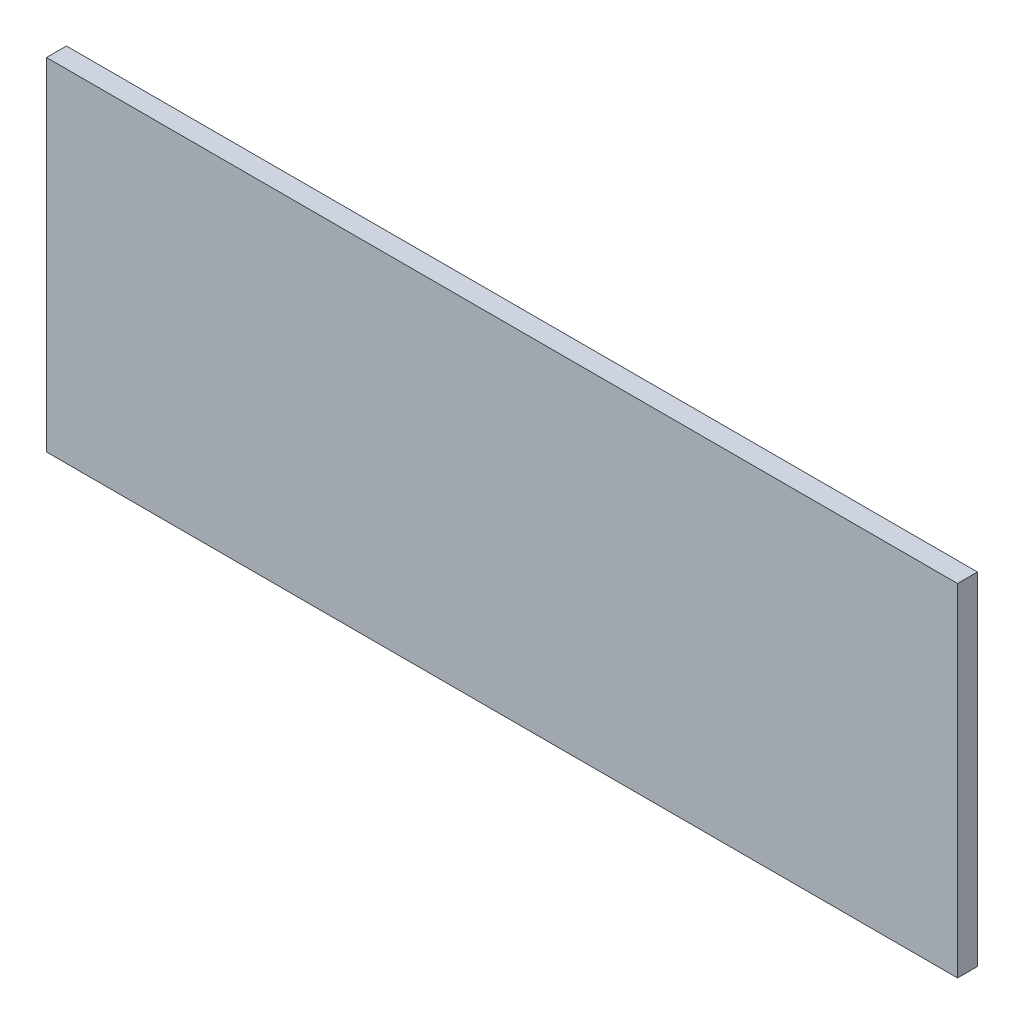
ISO-10303-21;
HEADER;
FILE_DESCRIPTION(('STEP AP214'),'2;1');
FILE_NAME('part.step','',(''),(''),'','','');
FILE_SCHEMA(('AUTOMOTIVE_DESIGN { 1 0 10303 214 1 1 1 1 }'));
ENDSEC;
DATA;
#1=APPLICATION_CONTEXT('core data for automotive mechanical design processes');
#2=APPLICATION_PROTOCOL_DEFINITION('international standard','automotive_design',2000,#1);
#3=PRODUCT_CONTEXT('',#1,'mechanical');
#4=PRODUCT('Part','Part','',(#3));
#5=PRODUCT_RELATED_PRODUCT_CATEGORY('part','',(#4));
#6=PRODUCT_DEFINITION_FORMATION('','',#4);
#7=PRODUCT_DEFINITION_CONTEXT('part definition',#1,'design');
#8=PRODUCT_DEFINITION('design','',#6,#7);
#9=PRODUCT_DEFINITION_SHAPE('','',#8);
#10=(LENGTH_UNIT() NAMED_UNIT(*) SI_UNIT(.MILLI.,.METRE.));
#11=(NAMED_UNIT(*) PLANE_ANGLE_UNIT() SI_UNIT($,.RADIAN.));
#12=(NAMED_UNIT(*) SI_UNIT($,.STERADIAN.) SOLID_ANGLE_UNIT());
#13=UNCERTAINTY_MEASURE_WITH_UNIT(LENGTH_MEASURE(1.E-05),#10,'distance_accuracy_value','');
#14=(GEOMETRIC_REPRESENTATION_CONTEXT(3) GLOBAL_UNCERTAINTY_ASSIGNED_CONTEXT((#13)) GLOBAL_UNIT_ASSIGNED_CONTEXT((#10,
#11,#12)) REPRESENTATION_CONTEXT('',''));
#15=CARTESIAN_POINT('',(0.,0.,0.));
#16=DIRECTION('',(0.,0.,1.));
#17=DIRECTION('',(1.,0.,0.));
#18=AXIS2_PLACEMENT_3D('',#15,#16,#17);
#19=CARTESIAN_POINT('',(885.,747.2,0.));
#20=DIRECTION('',(-1.,0.,0.));
#21=DIRECTION('',(0.,1.,0.));
#22=AXIS2_PLACEMENT_3D('',#19,#20,#21);
#23=PLANE('',#22);
#24=DIRECTION('',(0.,1.,0.));
#25=VECTOR('',#24,1.);
#26=CARTESIAN_POINT('',(885.,747.2,0.0350012));
#27=LINE('',#26,#25);
#28=CARTESIAN_POINT('',(885.,747.2,0.0350012));
#29=VERTEX_POINT('',#28);
#30=CARTESIAN_POINT('',(885.,747.8,0.0350012));
#31=VERTEX_POINT('',#30);
#32=EDGE_CURVE('E11',#29,#31,#27,.T.);
#33=ORIENTED_EDGE('',*,*,#32,.F.);
#34=DIRECTION('',(0.,0.,1.));
#35=VECTOR('',#34,1.);
#36=CARTESIAN_POINT('',(885.,747.2,0.));
#37=LINE('',#36,#35);
#38=CARTESIAN_POINT('',(885.,747.2,0.));
#39=VERTEX_POINT('',#38);
#40=EDGE_CURVE('E24',#39,#29,#37,.T.);
#41=ORIENTED_EDGE('',*,*,#40,.F.);
#42=DIRECTION('',(0.,1.,0.));
#43=VECTOR('',#42,1.);
#44=CARTESIAN_POINT('',(885.,747.2,0.));
#45=LINE('',#44,#43);
#46=CARTESIAN_POINT('',(885.,747.8,0.));
#47=VERTEX_POINT('',#46);
#48=EDGE_CURVE('E75',#39,#47,#45,.T.);
#49=ORIENTED_EDGE('',*,*,#48,.T.);
#50=DIRECTION('',(0.,0.,1.));
#51=VECTOR('',#50,1.);
#52=CARTESIAN_POINT('',(885.,747.8,0.));
#53=LINE('',#52,#51);
#54=EDGE_CURVE('E37',#47,#31,#53,.T.);
#55=ORIENTED_EDGE('',*,*,#54,.T.);
#56=EDGE_LOOP('',(#33,#41,#49,#55));
#57=FACE_BOUND('',#56,.T.);
#58=ADVANCED_FACE('F17',(#57),#23,.F.);
#59=CARTESIAN_POINT('',(885.,747.8,0.));
#60=DIRECTION('',(0.,-1.,0.));
#61=DIRECTION('',(-1.,0.,0.));
#62=AXIS2_PLACEMENT_3D('',#59,#60,#61);
#63=PLANE('',#62);
#64=DIRECTION('',(-1.,0.,0.));
#65=VECTOR('',#64,1.);
#66=CARTESIAN_POINT('',(885.,747.8,0.0350012));
#67=LINE('',#66,#65);
#68=CARTESIAN_POINT('',(883.4,747.8,0.0350012));
#69=VERTEX_POINT('',#68);
#70=EDGE_CURVE('E83',#31,#69,#67,.T.);
#71=ORIENTED_EDGE('',*,*,#70,.F.);
#72=ORIENTED_EDGE('',*,*,#54,.F.);
#73=DIRECTION('',(-1.,0.,0.));
#74=VECTOR('',#73,1.);
#75=CARTESIAN_POINT('',(885.,747.8,0.));
#76=LINE('',#75,#74);
#77=CARTESIAN_POINT('',(883.4,747.8,0.));
#78=VERTEX_POINT('',#77);
#79=EDGE_CURVE('E81',#47,#78,#76,.T.);
#80=ORIENTED_EDGE('',*,*,#79,.T.);
#81=DIRECTION('',(0.,0.,1.));
#82=VECTOR('',#81,1.);
#83=CARTESIAN_POINT('',(883.4,747.8,0.));
#84=LINE('',#83,#82);
#85=EDGE_CURVE('E67',#78,#69,#84,.T.);
#86=ORIENTED_EDGE('',*,*,#85,.T.);
#87=EDGE_LOOP('',(#71,#72,#80,#86));
#88=FACE_BOUND('',#87,.T.);
#89=ADVANCED_FACE('F89',(#88),#63,.F.);
#90=CARTESIAN_POINT('',(883.4,747.8,0.));
#91=DIRECTION('',(1.,0.,0.));
#92=DIRECTION('',(0.,-1.,0.));
#93=AXIS2_PLACEMENT_3D('',#90,#91,#92);
#94=PLANE('',#93);
#95=DIRECTION('',(0.,-1.,0.));
#96=VECTOR('',#95,1.);
#97=CARTESIAN_POINT('',(883.4,747.8,0.0350012));
#98=LINE('',#97,#96);
#99=CARTESIAN_POINT('',(883.4,747.2,0.0350012));
#100=VERTEX_POINT('',#99);
#101=EDGE_CURVE('E71',#69,#100,#98,.T.);
#102=ORIENTED_EDGE('',*,*,#101,.F.);
#103=ORIENTED_EDGE('',*,*,#85,.F.);
#104=DIRECTION('',(0.,-1.,0.));
#105=VECTOR('',#104,1.);
#106=CARTESIAN_POINT('',(883.4,747.8,0.));
#107=LINE('',#106,#105);
#108=CARTESIAN_POINT('',(883.4,747.2,0.));
#109=VERTEX_POINT('',#108);
#110=EDGE_CURVE('E63',#78,#109,#107,.T.);
#111=ORIENTED_EDGE('',*,*,#110,.T.);
#112=DIRECTION('',(0.,0.,1.));
#113=VECTOR('',#112,1.);
#114=CARTESIAN_POINT('',(883.4,747.2,0.));
#115=LINE('',#114,#113);
#116=EDGE_CURVE('E53',#109,#100,#115,.T.);
#117=ORIENTED_EDGE('',*,*,#116,.T.);
#118=EDGE_LOOP('',(#102,#103,#111,#117));
#119=FACE_BOUND('',#118,.T.);
#120=ADVANCED_FACE('F66',(#119),#94,.F.);
#121=CARTESIAN_POINT('',(883.4,747.2,0.));
#122=DIRECTION('',(0.,1.,0.));
#123=DIRECTION('',(1.,0.,0.));
#124=AXIS2_PLACEMENT_3D('',#121,#122,#123);
#125=PLANE('',#124);
#126=DIRECTION('',(1.,0.,0.));
#127=VECTOR('',#126,1.);
#128=CARTESIAN_POINT('',(883.4,747.2,0.0350012));
#129=LINE('',#128,#127);
#130=EDGE_CURVE('E59',#100,#29,#129,.T.);
#131=ORIENTED_EDGE('',*,*,#130,.F.);
#132=ORIENTED_EDGE('',*,*,#116,.F.);
#133=DIRECTION('',(1.,0.,0.));
#134=VECTOR('',#133,1.);
#135=CARTESIAN_POINT('',(883.4,747.2,0.));
#136=LINE('',#135,#134);
#137=EDGE_CURVE('E57',#109,#39,#136,.T.);
#138=ORIENTED_EDGE('',*,*,#137,.T.);
#139=ORIENTED_EDGE('',*,*,#40,.T.);
#140=EDGE_LOOP('',(#131,#132,#138,#139));
#141=FACE_BOUND('',#140,.T.);
#142=ADVANCED_FACE('F55',(#141),#125,.F.);
#143=CARTESIAN_POINT('',(884.2,747.5,0.));
#144=DIRECTION('',(0.,0.,1.));
#145=DIRECTION('',(1.,0.,0.));
#146=AXIS2_PLACEMENT_3D('',#143,#144,#145);
#147=PLANE('',#146);
#148=ORIENTED_EDGE('',*,*,#137,.F.);
#149=ORIENTED_EDGE('',*,*,#110,.F.);
#150=ORIENTED_EDGE('',*,*,#79,.F.);
#151=ORIENTED_EDGE('',*,*,#48,.F.);
#152=EDGE_LOOP('',(#148,#149,#150,#151));
#153=FACE_BOUND('',#152,.T.);
#154=ADVANCED_FACE('F74',(#153),#147,.F.);
#155=CARTESIAN_POINT('',(884.2,747.5,0.0350012));
#156=DIRECTION('',(0.,0.,1.));
#157=DIRECTION('',(1.,0.,0.));
#158=AXIS2_PLACEMENT_3D('',#155,#156,#157);
#159=PLANE('',#158);
#160=ORIENTED_EDGE('',*,*,#32,.T.);
#161=ORIENTED_EDGE('',*,*,#70,.T.);
#162=ORIENTED_EDGE('',*,*,#101,.T.);
#163=ORIENTED_EDGE('',*,*,#130,.T.);
#164=EDGE_LOOP('',(#160,#161,#162,#163));
#165=FACE_BOUND('',#164,.T.);
#166=ADVANCED_FACE('F91',(#165),#159,.T.);
#167=CLOSED_SHELL('',(#58,#89,#120,#142,#154,#166));
#168=MANIFOLD_SOLID_BREP('B1',#167);
#169=ADVANCED_BREP_SHAPE_REPRESENTATION('',(#18,#168),#14);
#170=SHAPE_DEFINITION_REPRESENTATION(#9,#169);
ENDSEC;
END-ISO-10303-21;
